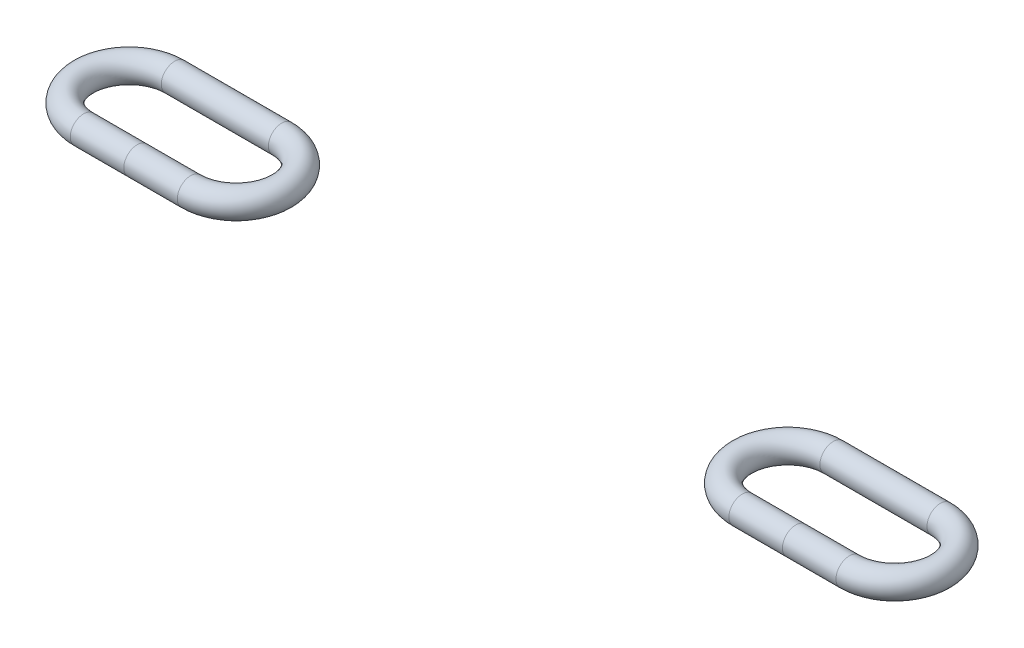
ISO-10303-21;
HEADER;
FILE_DESCRIPTION(('STEP AP214'),'2;1');
FILE_NAME('part.step','',(''),(''),'','','');
FILE_SCHEMA(('AUTOMOTIVE_DESIGN { 1 0 10303 214 1 1 1 1 }'));
ENDSEC;
DATA;
#1=APPLICATION_CONTEXT('core data for automotive mechanical design processes');
#2=APPLICATION_PROTOCOL_DEFINITION('international standard','automotive_design',2000,#1);
#3=PRODUCT_CONTEXT('',#1,'mechanical');
#4=PRODUCT('Part','Part','',(#3));
#5=PRODUCT_RELATED_PRODUCT_CATEGORY('part','',(#4));
#6=PRODUCT_DEFINITION_FORMATION('','',#4);
#7=PRODUCT_DEFINITION_CONTEXT('part definition',#1,'design');
#8=PRODUCT_DEFINITION('design','',#6,#7);
#9=PRODUCT_DEFINITION_SHAPE('','',#8);
#10=(LENGTH_UNIT() NAMED_UNIT(*) SI_UNIT(.MILLI.,.METRE.));
#11=(NAMED_UNIT(*) PLANE_ANGLE_UNIT() SI_UNIT($,.RADIAN.));
#12=(NAMED_UNIT(*) SI_UNIT($,.STERADIAN.) SOLID_ANGLE_UNIT());
#13=UNCERTAINTY_MEASURE_WITH_UNIT(LENGTH_MEASURE(1.E-05),#10,'distance_accuracy_value','');
#14=(GEOMETRIC_REPRESENTATION_CONTEXT(3) GLOBAL_UNCERTAINTY_ASSIGNED_CONTEXT((#13)) GLOBAL_UNIT_ASSIGNED_CONTEXT((#10,
#11,#12)) REPRESENTATION_CONTEXT('',''));
#15=CARTESIAN_POINT('',(0.,0.,0.));
#16=DIRECTION('',(0.,0.,1.));
#17=DIRECTION('',(1.,0.,0.));
#18=AXIS2_PLACEMENT_3D('',#15,#16,#17);
#19=CARTESIAN_POINT('',(-12.3,0.,0.85));
#20=DIRECTION('',(1.,0.,0.));
#21=DIRECTION('',(0.,0.,1.));
#22=AXIS2_PLACEMENT_3D('',#19,#20,#21);
#23=CYLINDRICAL_SURFACE('',#22,0.25);
#24=CARTESIAN_POINT('',(-11.3,0.,0.85));
#25=DIRECTION('',(1.,0.,0.));
#26=DIRECTION('',(0.,0.,-1.));
#27=AXIS2_PLACEMENT_3D('',#24,#25,#26);
#28=CIRCLE('',#27,0.25);
#29=CARTESIAN_POINT('',(-11.3,0.,1.1));
#30=VERTEX_POINT('',#29);
#31=EDGE_CURVE('E53',#30,#30,#28,.T.);
#32=ORIENTED_EDGE('',*,*,#31,.F.);
#33=EDGE_LOOP('',(#32));
#34=FACE_BOUND('',#33,.T.);
#35=CARTESIAN_POINT('',(-12.3,0.,0.85));
#36=DIRECTION('',(1.,0.,0.));
#37=DIRECTION('',(0.,0.,-1.));
#38=AXIS2_PLACEMENT_3D('',#35,#36,#37);
#39=CIRCLE('',#38,0.25);
#40=CARTESIAN_POINT('',(-12.3,0.,0.6));
#41=VERTEX_POINT('',#40);
#42=EDGE_CURVE('E58',#41,#41,#39,.T.);
#43=ORIENTED_EDGE('',*,*,#42,.T.);
#44=EDGE_LOOP('',(#43));
#45=FACE_BOUND('',#44,.T.);
#46=ADVANCED_FACE('F38',(#34,#45),#23,.T.);
#47=CARTESIAN_POINT('',(-11.3,0.,0.));
#48=DIRECTION('',(0.,-1.,0.));
#49=DIRECTION('',(0.,0.,-1.));
#50=AXIS2_PLACEMENT_3D('',#47,#48,#49);
#51=TOROIDAL_SURFACE('',#50,0.85,0.25);
#52=CARTESIAN_POINT('',(-11.3,0.,-0.85));
#53=DIRECTION('',(-1.,0.,0.));
#54=DIRECTION('',(0.,0.,1.));
#55=AXIS2_PLACEMENT_3D('',#52,#53,#54);
#56=CIRCLE('',#55,0.25);
#57=CARTESIAN_POINT('',(-11.3,0.,-1.1));
#58=VERTEX_POINT('',#57);
#59=EDGE_CURVE('E49',#58,#58,#56,.T.);
#60=CARTESIAN_POINT('',(-11.3,0.,0.));
#61=DIRECTION('',(0.,-1.,0.));
#62=DIRECTION('',(0.,0.,-1.));
#63=AXIS2_PLACEMENT_3D('',#60,#61,#62);
#64=CIRCLE('',#63,1.1);
#65=EDGE_CURVE('',#58,#30,#64,.T.);
#66=ORIENTED_EDGE('',*,*,#59,.F.);
#67=ORIENTED_EDGE('',*,*,#31,.T.);
#68=ORIENTED_EDGE('',*,*,#65,.T.);
#69=ORIENTED_EDGE('',*,*,#65,.F.);
#70=EDGE_LOOP('',(#66,#68,#67,#69));
#71=FACE_BOUND('',#70,.T.);
#72=ADVANCED_FACE('F71',(#71),#51,.T.);
#73=CARTESIAN_POINT('',(-11.3,0.,-0.85));
#74=DIRECTION('',(-1.,0.,0.));
#75=DIRECTION('',(0.,0.,-1.));
#76=AXIS2_PLACEMENT_3D('',#73,#74,#75);
#77=CYLINDRICAL_SURFACE('',#76,0.25);
#78=CARTESIAN_POINT('',(-13.3,0.,-0.85));
#79=DIRECTION('',(-1.,0.,0.));
#80=DIRECTION('',(0.,0.,1.));
#81=AXIS2_PLACEMENT_3D('',#78,#79,#80);
#82=CIRCLE('',#81,0.25);
#83=CARTESIAN_POINT('',(-13.3,0.,-1.1));
#84=VERTEX_POINT('',#83);
#85=EDGE_CURVE('E45',#84,#84,#82,.T.);
#86=ORIENTED_EDGE('',*,*,#85,.F.);
#87=EDGE_LOOP('',(#86));
#88=FACE_BOUND('',#87,.T.);
#89=ORIENTED_EDGE('',*,*,#59,.T.);
#90=EDGE_LOOP('',(#89));
#91=FACE_BOUND('',#90,.T.);
#92=ADVANCED_FACE('F68',(#88,#91),#77,.T.);
#93=CARTESIAN_POINT('',(-13.3,0.,0.));
#94=DIRECTION('',(0.,-1.,0.));
#95=DIRECTION('',(0.,0.,-1.));
#96=AXIS2_PLACEMENT_3D('',#93,#94,#95);
#97=TOROIDAL_SURFACE('',#96,0.85,0.25);
#98=CARTESIAN_POINT('',(-13.3,0.,0.85));
#99=DIRECTION('',(1.,0.,0.));
#100=DIRECTION('',(0.,0.,-1.));
#101=AXIS2_PLACEMENT_3D('',#98,#99,#100);
#102=CIRCLE('',#101,0.25);
#103=CARTESIAN_POINT('',(-13.3,0.,1.1));
#104=VERTEX_POINT('',#103);
#105=EDGE_CURVE('E11',#104,#104,#102,.T.);
#106=CARTESIAN_POINT('',(-13.3,0.,0.));
#107=DIRECTION('',(0.,-1.,0.));
#108=DIRECTION('',(0.,0.,-1.));
#109=AXIS2_PLACEMENT_3D('',#106,#107,#108);
#110=CIRCLE('',#109,1.1);
#111=EDGE_CURVE('',#104,#84,#110,.T.);
#112=ORIENTED_EDGE('',*,*,#105,.F.);
#113=ORIENTED_EDGE('',*,*,#85,.T.);
#114=ORIENTED_EDGE('',*,*,#111,.T.);
#115=ORIENTED_EDGE('',*,*,#111,.F.);
#116=EDGE_LOOP('',(#112,#114,#113,#115));
#117=FACE_BOUND('',#116,.T.);
#118=ADVANCED_FACE('F64',(#117),#97,.T.);
#119=CARTESIAN_POINT('',(-13.3,0.,0.85));
#120=DIRECTION('',(1.,0.,0.));
#121=DIRECTION('',(0.,0.,1.));
#122=AXIS2_PLACEMENT_3D('',#119,#120,#121);
#123=CYLINDRICAL_SURFACE('',#122,0.25);
#124=ORIENTED_EDGE('',*,*,#42,.F.);
#125=EDGE_LOOP('',(#124));
#126=FACE_BOUND('',#125,.T.);
#127=ORIENTED_EDGE('',*,*,#105,.T.);
#128=EDGE_LOOP('',(#127));
#129=FACE_BOUND('',#128,.T.);
#130=ADVANCED_FACE('F40',(#126,#129),#123,.T.);
#131=CLOSED_SHELL('',(#46,#72,#92,#118,#130));
#132=MANIFOLD_SOLID_BREP('B2',#131);
#133=CARTESIAN_POINT('',(0.,0.,0.85));
#134=DIRECTION('',(-1.,0.,0.));
#135=DIRECTION('',(0.,0.,1.));
#136=AXIS2_PLACEMENT_3D('',#133,#134,#135);
#137=CYLINDRICAL_SURFACE('',#136,0.25);
#138=CARTESIAN_POINT('',(-1.,0.,0.85));
#139=DIRECTION('',(1.,0.,0.));
#140=DIRECTION('',(0.,0.,-1.));
#141=AXIS2_PLACEMENT_3D('',#138,#139,#140);
#142=CIRCLE('',#141,0.25);
#143=CARTESIAN_POINT('',(-1.,0.,1.1));
#144=VERTEX_POINT('',#143);
#145=EDGE_CURVE('E129',#144,#144,#142,.T.);
#146=ORIENTED_EDGE('',*,*,#145,.T.);
#147=EDGE_LOOP('',(#146));
#148=FACE_BOUND('',#147,.T.);
#149=CARTESIAN_POINT('',(0.,0.,0.85));
#150=DIRECTION('',(1.,0.,0.));
#151=DIRECTION('',(0.,0.,-1.));
#152=AXIS2_PLACEMENT_3D('',#149,#150,#151);
#153=CIRCLE('',#152,0.25);
#154=CARTESIAN_POINT('',(0.,0.,0.6));
#155=VERTEX_POINT('',#154);
#156=EDGE_CURVE('E134',#155,#155,#153,.T.);
#157=ORIENTED_EDGE('',*,*,#156,.F.);
#158=EDGE_LOOP('',(#157));
#159=FACE_BOUND('',#158,.T.);
#160=ADVANCED_FACE('F114',(#148,#159),#137,.T.);
#161=CARTESIAN_POINT('',(-1.,0.,0.));
#162=DIRECTION('',(0.,-1.,0.));
#163=DIRECTION('',(0.,0.,-1.));
#164=AXIS2_PLACEMENT_3D('',#161,#162,#163);
#165=TOROIDAL_SURFACE('',#164,0.85,0.25);
#166=CARTESIAN_POINT('',(-1.,0.,-0.85));
#167=DIRECTION('',(-1.,0.,0.));
#168=DIRECTION('',(0.,0.,1.));
#169=AXIS2_PLACEMENT_3D('',#166,#167,#168);
#170=CIRCLE('',#169,0.25);
#171=CARTESIAN_POINT('',(-1.,0.,-1.1));
#172=VERTEX_POINT('',#171);
#173=EDGE_CURVE('E125',#172,#172,#170,.T.);
#174=CARTESIAN_POINT('',(-1.,0.,0.));
#175=DIRECTION('',(0.,-1.,0.));
#176=DIRECTION('',(0.,0.,-1.));
#177=AXIS2_PLACEMENT_3D('',#174,#175,#176);
#178=CIRCLE('',#177,1.1);
#179=EDGE_CURVE('',#144,#172,#178,.T.);
#180=ORIENTED_EDGE('',*,*,#145,.F.);
#181=ORIENTED_EDGE('',*,*,#173,.T.);
#182=ORIENTED_EDGE('',*,*,#179,.T.);
#183=ORIENTED_EDGE('',*,*,#179,.F.);
#184=EDGE_LOOP('',(#180,#182,#181,#183));
#185=FACE_BOUND('',#184,.T.);
#186=ADVANCED_FACE('F141',(#185),#165,.T.);
#187=CARTESIAN_POINT('',(-1.,0.,-0.85));
#188=DIRECTION('',(1.,0.,0.));
#189=DIRECTION('',(0.,0.,-1.));
#190=AXIS2_PLACEMENT_3D('',#187,#188,#189);
#191=CYLINDRICAL_SURFACE('',#190,0.25);
#192=CARTESIAN_POINT('',(1.,0.,-0.85));
#193=DIRECTION('',(-1.,0.,0.));
#194=DIRECTION('',(0.,0.,1.));
#195=AXIS2_PLACEMENT_3D('',#192,#193,#194);
#196=CIRCLE('',#195,0.25);
#197=CARTESIAN_POINT('',(1.,0.,-1.1));
#198=VERTEX_POINT('',#197);
#199=EDGE_CURVE('E121',#198,#198,#196,.T.);
#200=ORIENTED_EDGE('',*,*,#199,.T.);
#201=EDGE_LOOP('',(#200));
#202=FACE_BOUND('',#201,.T.);
#203=ORIENTED_EDGE('',*,*,#173,.F.);
#204=EDGE_LOOP('',(#203));
#205=FACE_BOUND('',#204,.T.);
#206=ADVANCED_FACE('F147',(#202,#205),#191,.T.);
#207=CARTESIAN_POINT('',(1.,0.,0.));
#208=DIRECTION('',(0.,-1.,0.));
#209=DIRECTION('',(0.,0.,-1.));
#210=AXIS2_PLACEMENT_3D('',#207,#208,#209);
#211=TOROIDAL_SURFACE('',#210,0.85,0.25);
#212=CARTESIAN_POINT('',(1.,0.,0.85));
#213=DIRECTION('',(1.,0.,0.));
#214=DIRECTION('',(0.,0.,-1.));
#215=AXIS2_PLACEMENT_3D('',#212,#213,#214);
#216=CIRCLE('',#215,0.25);
#217=CARTESIAN_POINT('',(1.,0.,1.1));
#218=VERTEX_POINT('',#217);
#219=EDGE_CURVE('E37',#218,#218,#216,.T.);
#220=CARTESIAN_POINT('',(1.,0.,0.));
#221=DIRECTION('',(0.,-1.,0.));
#222=DIRECTION('',(0.,0.,-1.));
#223=AXIS2_PLACEMENT_3D('',#220,#221,#222);
#224=CIRCLE('',#223,1.1);
#225=EDGE_CURVE('',#198,#218,#224,.T.);
#226=ORIENTED_EDGE('',*,*,#199,.F.);
#227=ORIENTED_EDGE('',*,*,#219,.T.);
#228=ORIENTED_EDGE('',*,*,#225,.T.);
#229=ORIENTED_EDGE('',*,*,#225,.F.);
#230=EDGE_LOOP('',(#226,#228,#227,#229));
#231=FACE_BOUND('',#230,.T.);
#232=ADVANCED_FACE('F152',(#231),#211,.T.);
#233=CARTESIAN_POINT('',(1.,0.,0.85));
#234=DIRECTION('',(-1.,0.,0.));
#235=DIRECTION('',(0.,0.,1.));
#236=AXIS2_PLACEMENT_3D('',#233,#234,#235);
#237=CYLINDRICAL_SURFACE('',#236,0.25);
#238=ORIENTED_EDGE('',*,*,#156,.T.);
#239=EDGE_LOOP('',(#238));
#240=FACE_BOUND('',#239,.T.);
#241=ORIENTED_EDGE('',*,*,#219,.F.);
#242=EDGE_LOOP('',(#241));
#243=FACE_BOUND('',#242,.T.);
#244=ADVANCED_FACE('F116',(#240,#243),#237,.T.);
#245=CLOSED_SHELL('',(#160,#186,#206,#232,#244));
#246=MANIFOLD_SOLID_BREP('B6',#245);
#247=ADVANCED_BREP_SHAPE_REPRESENTATION('',(#18,#132,#246),#14);
#248=SHAPE_DEFINITION_REPRESENTATION(#9,#247);
ENDSEC;
END-ISO-10303-21;
